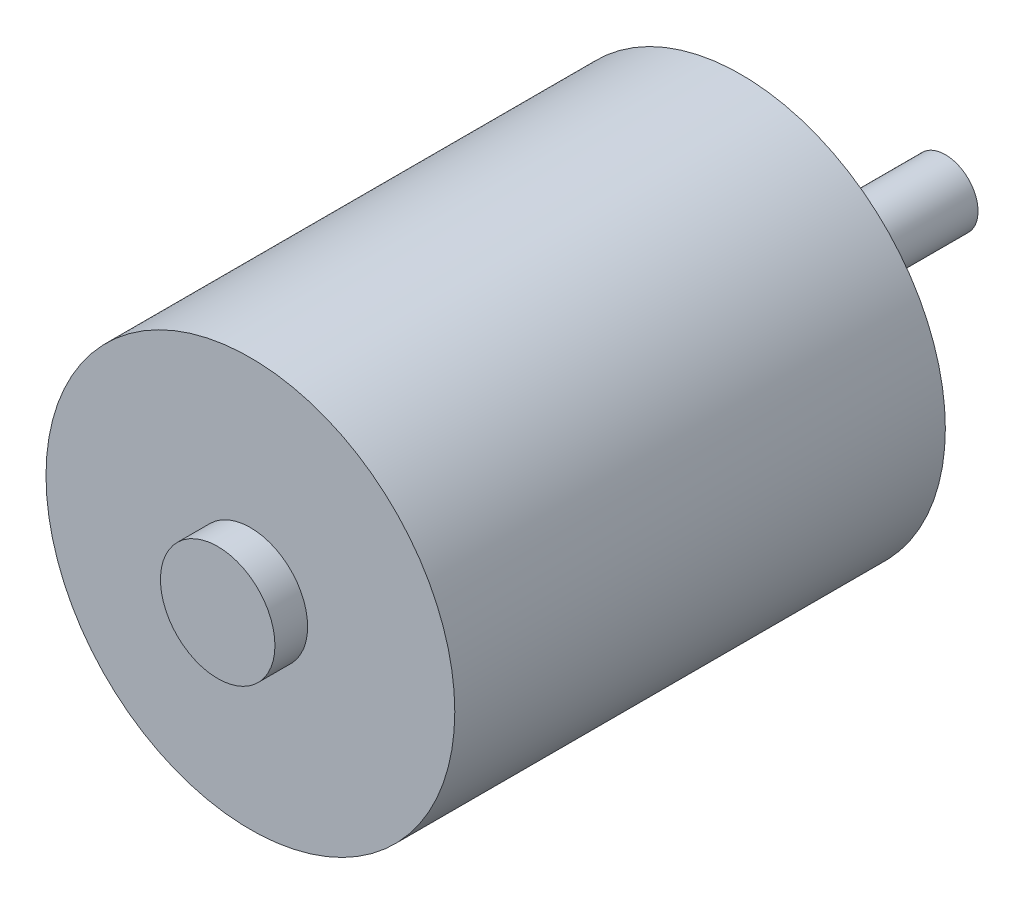
ISO-10303-21;
HEADER;
FILE_DESCRIPTION(('STEP AP214'),'2;1');
FILE_NAME('part.step','',(''),(''),'','','');
FILE_SCHEMA(('AUTOMOTIVE_DESIGN { 1 0 10303 214 1 1 1 1 }'));
ENDSEC;
DATA;
#1=APPLICATION_CONTEXT('core data for automotive mechanical design processes');
#2=APPLICATION_PROTOCOL_DEFINITION('international standard','automotive_design',2000,#1);
#3=PRODUCT_CONTEXT('',#1,'mechanical');
#4=PRODUCT('Part','Part','',(#3));
#5=PRODUCT_RELATED_PRODUCT_CATEGORY('part','',(#4));
#6=PRODUCT_DEFINITION_FORMATION('','',#4);
#7=PRODUCT_DEFINITION_CONTEXT('part definition',#1,'design');
#8=PRODUCT_DEFINITION('design','',#6,#7);
#9=PRODUCT_DEFINITION_SHAPE('','',#8);
#10=(LENGTH_UNIT() NAMED_UNIT(*) SI_UNIT(.MILLI.,.METRE.));
#11=(NAMED_UNIT(*) PLANE_ANGLE_UNIT() SI_UNIT($,.RADIAN.));
#12=(NAMED_UNIT(*) SI_UNIT($,.STERADIAN.) SOLID_ANGLE_UNIT());
#13=UNCERTAINTY_MEASURE_WITH_UNIT(LENGTH_MEASURE(1.E-05),#10,'distance_accuracy_value','');
#14=(GEOMETRIC_REPRESENTATION_CONTEXT(3) GLOBAL_UNCERTAINTY_ASSIGNED_CONTEXT((#13)) GLOBAL_UNIT_ASSIGNED_CONTEXT((#10,
#11,#12)) REPRESENTATION_CONTEXT('',''));
#15=CARTESIAN_POINT('',(0.,0.,0.));
#16=DIRECTION('',(0.,0.,1.));
#17=DIRECTION('',(1.,0.,0.));
#18=AXIS2_PLACEMENT_3D('',#15,#16,#17);
#19=CARTESIAN_POINT('',(0.,0.,7.));
#20=DIRECTION('',(0.,0.,-1.));
#21=DIRECTION('',(-1.,0.,0.));
#22=AXIS2_PLACEMENT_3D('',#19,#20,#21);
#23=CYLINDRICAL_SURFACE('',#22,25.);
#24=CARTESIAN_POINT('',(0.,0.,0.));
#25=DIRECTION('',(0.,0.,1.));
#26=DIRECTION('',(1.,0.,0.));
#27=AXIS2_PLACEMENT_3D('',#24,#25,#26);
#28=CIRCLE('',#27,25.);
#29=CARTESIAN_POINT('',(25.,0.,0.));
#30=VERTEX_POINT('',#29);
#31=EDGE_CURVE('E38',#30,#30,#28,.T.);
#32=ORIENTED_EDGE('',*,*,#31,.T.);
#33=EDGE_LOOP('',(#32));
#34=FACE_BOUND('',#33,.T.);
#35=CARTESIAN_POINT('',(0.,0.,60.));
#36=DIRECTION('',(0.,0.,1.));
#37=DIRECTION('',(1.,0.,0.));
#38=AXIS2_PLACEMENT_3D('',#35,#36,#37);
#39=CIRCLE('',#38,25.);
#40=CARTESIAN_POINT('',(25.,0.,60.));
#41=VERTEX_POINT('',#40);
#42=EDGE_CURVE('E50',#41,#41,#39,.T.);
#43=ORIENTED_EDGE('',*,*,#42,.F.);
#44=EDGE_LOOP('',(#43));
#45=FACE_BOUND('',#44,.T.);
#46=ADVANCED_FACE('F35',(#34,#45),#23,.T.);
#47=CARTESIAN_POINT('',(0.,0.,0.));
#48=DIRECTION('',(0.,0.,1.));
#49=DIRECTION('',(1.,0.,0.));
#50=AXIS2_PLACEMENT_3D('',#47,#48,#49);
#51=PLANE('',#50);
#52=CARTESIAN_POINT('',(0.,0.,0.));
#53=DIRECTION('',(0.,0.,-1.));
#54=DIRECTION('',(-1.,0.,0.));
#55=AXIS2_PLACEMENT_3D('',#52,#53,#54);
#56=CIRCLE('',#55,4.);
#57=CARTESIAN_POINT('',(-4.,0.,0.));
#58=VERTEX_POINT('',#57);
#59=EDGE_CURVE('E42',#58,#58,#56,.T.);
#60=ORIENTED_EDGE('',*,*,#59,.F.);
#61=EDGE_LOOP('',(#60));
#62=FACE_BOUND('',#61,.T.);
#63=ORIENTED_EDGE('',*,*,#31,.F.);
#64=EDGE_LOOP('',(#63));
#65=FACE_BOUND('',#64,.T.);
#66=ADVANCED_FACE('F62',(#62,#65),#51,.F.);
#67=CARTESIAN_POINT('',(0.,0.,-25.));
#68=DIRECTION('',(0.,0.,1.));
#69=DIRECTION('',(1.,0.,0.));
#70=AXIS2_PLACEMENT_3D('',#67,#68,#69);
#71=CYLINDRICAL_SURFACE('',#70,4.);
#72=CARTESIAN_POINT('',(0.,0.,-25.));
#73=DIRECTION('',(0.,0.,-1.));
#74=DIRECTION('',(-1.,0.,0.));
#75=AXIS2_PLACEMENT_3D('',#72,#73,#74);
#76=CIRCLE('',#75,4.);
#77=CARTESIAN_POINT('',(-4.,0.,-25.));
#78=VERTEX_POINT('',#77);
#79=EDGE_CURVE('E53',#78,#78,#76,.T.);
#80=ORIENTED_EDGE('',*,*,#79,.F.);
#81=EDGE_LOOP('',(#80));
#82=FACE_BOUND('',#81,.T.);
#83=ORIENTED_EDGE('',*,*,#59,.T.);
#84=EDGE_LOOP('',(#83));
#85=FACE_BOUND('',#84,.T.);
#86=ADVANCED_FACE('F64',(#82,#85),#71,.T.);
#87=CARTESIAN_POINT('',(0.,0.,-25.));
#88=DIRECTION('',(0.,0.,-1.));
#89=DIRECTION('',(-1.,0.,0.));
#90=AXIS2_PLACEMENT_3D('',#87,#88,#89);
#91=PLANE('',#90);
#92=ORIENTED_EDGE('',*,*,#79,.T.);
#93=EDGE_LOOP('',(#92));
#94=FACE_BOUND('',#93,.T.);
#95=ADVANCED_FACE('F70',(#94),#91,.T.);
#96=CARTESIAN_POINT('',(0.,0.,60.));
#97=DIRECTION('',(0.,0.,1.));
#98=DIRECTION('',(1.,0.,0.));
#99=AXIS2_PLACEMENT_3D('',#96,#97,#98);
#100=PLANE('',#99);
#101=CARTESIAN_POINT('',(0.,0.,60.));
#102=DIRECTION('',(0.,0.,1.));
#103=DIRECTION('',(1.,0.,0.));
#104=AXIS2_PLACEMENT_3D('',#101,#102,#103);
#105=CIRCLE('',#104,7.);
#106=CARTESIAN_POINT('',(7.,0.,60.));
#107=VERTEX_POINT('',#106);
#108=EDGE_CURVE('E10',#107,#107,#105,.T.);
#109=ORIENTED_EDGE('',*,*,#108,.F.);
#110=EDGE_LOOP('',(#109));
#111=FACE_BOUND('',#110,.T.);
#112=ORIENTED_EDGE('',*,*,#42,.T.);
#113=EDGE_LOOP('',(#112));
#114=FACE_BOUND('',#113,.T.);
#115=ADVANCED_FACE('F77',(#111,#114),#100,.T.);
#116=CARTESIAN_POINT('',(0.,0.,64.));
#117=DIRECTION('',(0.,0.,-1.));
#118=DIRECTION('',(-1.,0.,0.));
#119=AXIS2_PLACEMENT_3D('',#116,#117,#118);
#120=CYLINDRICAL_SURFACE('',#119,7.);
#121=CARTESIAN_POINT('',(0.,0.,64.));
#122=DIRECTION('',(0.,0.,1.));
#123=DIRECTION('',(1.,0.,0.));
#124=AXIS2_PLACEMENT_3D('',#121,#122,#123);
#125=CIRCLE('',#124,7.);
#126=CARTESIAN_POINT('',(7.,0.,64.));
#127=VERTEX_POINT('',#126);
#128=EDGE_CURVE('E49',#127,#127,#125,.T.);
#129=ORIENTED_EDGE('',*,*,#128,.F.);
#130=EDGE_LOOP('',(#129));
#131=FACE_BOUND('',#130,.T.);
#132=ORIENTED_EDGE('',*,*,#108,.T.);
#133=EDGE_LOOP('',(#132));
#134=FACE_BOUND('',#133,.T.);
#135=ADVANCED_FACE('F80',(#131,#134),#120,.T.);
#136=CARTESIAN_POINT('',(0.,0.,64.));
#137=DIRECTION('',(0.,0.,1.));
#138=DIRECTION('',(1.,0.,0.));
#139=AXIS2_PLACEMENT_3D('',#136,#137,#138);
#140=PLANE('',#139);
#141=ORIENTED_EDGE('',*,*,#128,.T.);
#142=EDGE_LOOP('',(#141));
#143=FACE_BOUND('',#142,.T.);
#144=ADVANCED_FACE('F84',(#143),#140,.T.);
#145=CLOSED_SHELL('',(#46,#66,#86,#95,#115,#135,#144));
#146=MANIFOLD_SOLID_BREP('B2',#145);
#147=ADVANCED_BREP_SHAPE_REPRESENTATION('',(#18,#146),#14);
#148=SHAPE_DEFINITION_REPRESENTATION(#9,#147);
ENDSEC;
END-ISO-10303-21;
